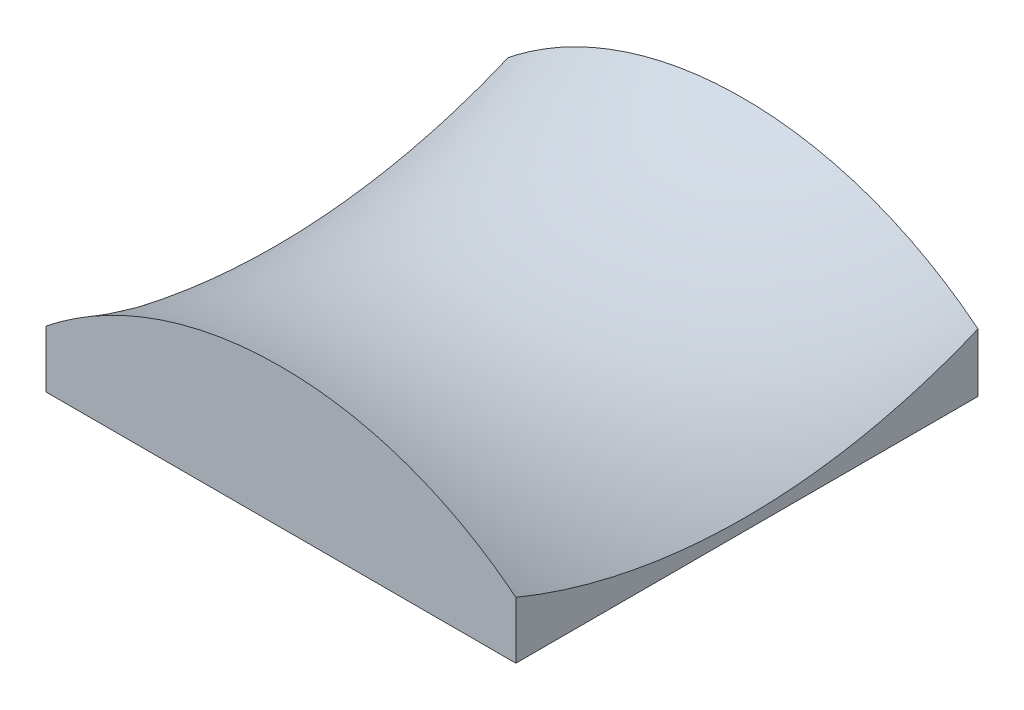
ISO-10303-21;
HEADER;
FILE_DESCRIPTION(('STEP AP214'),'2;1');
FILE_NAME('part.step','',(''),(''),'','','');
FILE_SCHEMA(('AUTOMOTIVE_DESIGN { 1 0 10303 214 1 1 1 1 }'));
ENDSEC;
DATA;
#1=APPLICATION_CONTEXT('core data for automotive mechanical design processes');
#2=APPLICATION_PROTOCOL_DEFINITION('international standard','automotive_design',2000,#1);
#3=PRODUCT_CONTEXT('',#1,'mechanical');
#4=PRODUCT('Part','Part','',(#3));
#5=PRODUCT_RELATED_PRODUCT_CATEGORY('part','',(#4));
#6=PRODUCT_DEFINITION_FORMATION('','',#4);
#7=PRODUCT_DEFINITION_CONTEXT('part definition',#1,'design');
#8=PRODUCT_DEFINITION('design','',#6,#7);
#9=PRODUCT_DEFINITION_SHAPE('','',#8);
#10=(LENGTH_UNIT() NAMED_UNIT(*) SI_UNIT(.MILLI.,.METRE.));
#11=(NAMED_UNIT(*) PLANE_ANGLE_UNIT() SI_UNIT($,.RADIAN.));
#12=(NAMED_UNIT(*) SI_UNIT($,.STERADIAN.) SOLID_ANGLE_UNIT());
#13=UNCERTAINTY_MEASURE_WITH_UNIT(LENGTH_MEASURE(1.E-05),#10,'distance_accuracy_value','');
#14=(GEOMETRIC_REPRESENTATION_CONTEXT(3) GLOBAL_UNCERTAINTY_ASSIGNED_CONTEXT((#13)) GLOBAL_UNIT_ASSIGNED_CONTEXT((#10,
#11,#12)) REPRESENTATION_CONTEXT('',''));
#15=CARTESIAN_POINT('',(0.,0.,0.));
#16=DIRECTION('',(0.,0.,1.));
#17=DIRECTION('',(1.,0.,0.));
#18=AXIS2_PLACEMENT_3D('',#15,#16,#17);
#19=CARTESIAN_POINT('',(-63.5,20.1195903798692,-62.9245870940822));
#20=DIRECTION('',(1.,0.,0.));
#21=DIRECTION('',(0.,0.,-1.));
#22=AXIS2_PLACEMENT_3D('',#19,#20,#21);
#23=PLANE('',#22);
#24=CARTESIAN_POINT('',(-63.5,-9.58852542034039,62.9245870940823));
#25=CARTESIAN_POINT('',(-63.5,-11.6771339613547,57.9611519657451));
#26=CARTESIAN_POINT('',(-63.5,-15.359738158942,47.8261554328779));
#27=CARTESIAN_POINT('',(-63.4999999999999,-19.3448665061603,32.1497916107984));
#28=CARTESIAN_POINT('',(-63.5000000000001,-21.751907816955,16.154924222973));
#29=CARTESIAN_POINT('',(-63.5,-22.2885254203404,5.38497668618995));
#30=CARTESIAN_POINT('',(-63.5,-22.2885254203403,-5.38497668619003));
#31=CARTESIAN_POINT('',(-63.5,-21.7519078169548,-16.1549242229729));
#32=CARTESIAN_POINT('',(-63.5,-19.3448665061598,-32.1497916107985));
#33=CARTESIAN_POINT('',(-63.5,-15.3597381589413,-47.8261554328778));
#34=CARTESIAN_POINT('',(-63.5,-11.6771339613538,-57.961151965745));
#35=CARTESIAN_POINT('',(-63.5,-9.58852542033947,-62.9245870940822));
#36=B_SPLINE_CURVE_WITH_KNOTS('',3,(#24,#25,#26,#27,#28,#29,#30,#31,#32,#33,#34,#35),
.UNSPECIFIED.,.F.,.F.,(4,1,1,1,2,1,1,1,4),(0.,0.125,0.25,0.375,0.5,0.625,0.75,0.875,1.),.UNSPECIFIED.);
#37=CARTESIAN_POINT('',(-63.5,-9.58852542033947,-62.9245870940822));
#38=VERTEX_POINT('',#37);
#39=CARTESIAN_POINT('',(-63.5,-9.97729039613173,61.9926057392416));
#40=VERTEX_POINT('',#39);
#41=EDGE_CURVE('E120',#38,#40,#36,.F.);
#42=ORIENTED_EDGE('',*,*,#41,.F.);
#43=DIRECTION('',(0.,-1.,0.));
#44=VECTOR('',#43,1.);
#45=CARTESIAN_POINT('',(-63.5,20.1195903798692,-62.9245870940822));
#46=LINE('',#45,#44);
#47=CARTESIAN_POINT('',(-63.5,-25.4,-62.9245870940822));
#48=VERTEX_POINT('',#47);
#49=EDGE_CURVE('E73',#38,#48,#46,.T.);
#50=ORIENTED_EDGE('',*,*,#49,.T.);
#51=DIRECTION('',(0.,0.,1.));
#52=VECTOR('',#51,1.);
#53=CARTESIAN_POINT('',(-63.5,-25.4,-62.9245870940822));
#54=LINE('',#53,#52);
#55=CARTESIAN_POINT('',(-63.5,-25.4,61.9926057392416));
#56=VERTEX_POINT('',#55);
#57=EDGE_CURVE('E118',#48,#56,#54,.T.);
#58=ORIENTED_EDGE('',*,*,#57,.T.);
#59=DIRECTION('',(0.,-1.,0.));
#60=VECTOR('',#59,1.);
#61=CARTESIAN_POINT('',(-63.5,20.1195903798692,61.9926057392416));
#62=LINE('',#61,#60);
#63=EDGE_CURVE('E108',#40,#56,#62,.T.);
#64=ORIENTED_EDGE('',*,*,#63,.F.);
#65=EDGE_LOOP('',(#42,#50,#58,#64));
#66=FACE_BOUND('',#65,.T.);
#67=ADVANCED_FACE('F66',(#66),#23,.F.);
#68=CARTESIAN_POINT('',(-63.5,20.1195903798692,61.9926057392416));
#69=DIRECTION('',(0.,0.,-1.));
#70=DIRECTION('',(-1.,0.,0.));
#71=AXIS2_PLACEMENT_3D('',#68,#69,#70);
#72=PLANE('',#71);
#73=CARTESIAN_POINT('',(-63.5,-9.97729039613173,61.9926057392416));
#74=CARTESIAN_POINT('',(-62.3858267250707,-9.08519551380279,61.9926057392416));
#75=CARTESIAN_POINT('',(-61.2530087164492,-8.21636995396604,61.9926057392416));
#76=CARTESIAN_POINT('',(-58.9519717874313,-6.52693070912617,61.9926057392416));
#77=CARTESIAN_POINT('',(-57.7837527594994,-5.70631717059594,61.9926057392416));
#78=CARTESIAN_POINT('',(-55.4138226699182,-4.11498972369493,61.9926057392416));
#79=CARTESIAN_POINT('',(-54.2121119908295,-3.34427524568298,61.9926057392416));
#80=CARTESIAN_POINT('',(-51.7772442025432,-1.85425068168243,61.9926057392416));
#81=CARTESIAN_POINT('',(-50.5440873223408,-1.1349402215083,61.9926057392416));
#82=CARTESIAN_POINT('',(-48.0493413743138,0.250411461218553,61.9926057392416));
#83=CARTESIAN_POINT('',(-46.7877729567808,0.91648986840684,61.9926057392416));
#84=CARTESIAN_POINT('',(-44.2376242476867,2.19468531568515,61.9926057392416));
#85=CARTESIAN_POINT('',(-42.9490445118388,2.80680346457212,61.9926057392416));
#86=CARTESIAN_POINT('',(-40.34715683212,3.97598156227411,61.9926057392416));
#87=CARTESIAN_POINT('',(-39.0338492372394,4.53304228743555,61.9926057392416));
#88=CARTESIAN_POINT('',(-36.3848984626601,5.59112476005631,61.9926057392416));
#89=CARTESIAN_POINT('',(-35.049255465449,6.09214696511203,61.9926057392416));
#90=CARTESIAN_POINT('',(-31.9085068927262,7.19516796209275,61.9926057392416));
#91=CARTESIAN_POINT('',(-30.0955719509714,7.77501630113208,61.9926057392416));
#92=CARTESIAN_POINT('',(-26.4399671038488,8.83179619002194,61.9926057392416));
#93=CARTESIAN_POINT('',(-24.5972964835928,9.30872526157242,61.9926057392416));
#94=CARTESIAN_POINT('',(-20.8880597046299,10.1583526425888,61.9926057392416));
#95=CARTESIAN_POINT('',(-19.0214934441596,10.5310505080148,61.9926057392416));
#96=CARTESIAN_POINT('',(-15.2708906801847,11.1711239899075,61.9926057392416));
#97=CARTESIAN_POINT('',(-13.3868587925481,11.4385266651528,61.9926057392416));
#98=CARTESIAN_POINT('',(-9.60679700298625,11.8674516630818,61.9926057392416));
#99=CARTESIAN_POINT('',(-7.71076719657034,12.0289748275515,61.9926057392416));
#100=CARTESIAN_POINT('',(-3.91264992682951,12.2457324586483,61.9926057392416));
#101=CARTESIAN_POINT('',(-2.01056248339513,12.3009672739187,61.9926057392415));
#102=CARTESIAN_POINT('',(1.79744519296852,12.3050143596191,61.9926057392415));
#103=CARTESIAN_POINT('',(3.7033656504428,12.2536184003666,61.9926057392416));
#104=CARTESIAN_POINT('',(7.50934530576351,12.0441122955624,61.9926057392416));
#105=CARTESIAN_POINT('',(9.40940446682123,11.8860014815734,61.9926057392416));
#106=CARTESIAN_POINT('',(13.1976825058477,11.4634673017587,61.9926057392416));
#107=CARTESIAN_POINT('',(15.0859012833029,11.1990430346709,61.9926057392416));
#108=CARTESIAN_POINT('',(18.8450260470154,10.5644830477057,61.9926057392416));
#109=CARTESIAN_POINT('',(20.7159271978978,10.1943186710272,61.9926057392416));
#110=CARTESIAN_POINT('',(24.4339172992252,9.34931169464277,61.9926057392416));
#111=CARTESIAN_POINT('',(26.2810063602229,8.87446958111026,61.9926057392416));
#112=CARTESIAN_POINT('',(29.9454981167175,7.82141423965829,61.9926057392416));
#113=CARTESIAN_POINT('',(31.7629014879997,7.24320336848518,61.9926057392416));
#114=CARTESIAN_POINT('',(34.9146821602635,6.14153419648396,61.9926057392416));
#115=CARTESIAN_POINT('',(36.2568386419594,5.64018901610861,61.9926057392416));
#116=CARTESIAN_POINT('',(38.9186974001437,4.58094255509184,61.9926057392416));
#117=CARTESIAN_POINT('',(40.2383994501779,4.02304070446741,61.9926057392416));
#118=CARTESIAN_POINT('',(42.8529235567109,2.85167138948634,61.9926057392416));
#119=CARTESIAN_POINT('',(44.1477452296799,2.23820306940696,61.9926057392416));
#120=CARTESIAN_POINT('',(46.7101928539036,0.956809680182645,61.9926057392416));
#121=CARTESIAN_POINT('',(47.9778182241252,0.288883449036795,61.9926057392416));
#122=CARTESIAN_POINT('',(50.484492066055,-1.10066381601003,61.9926057392416));
#123=CARTESIAN_POINT('',(51.7235191027851,-1.82232351498231,61.9926057392416));
#124=CARTESIAN_POINT('',(54.1698784493954,-3.31751673450718,61.9926057392416));
#125=CARTESIAN_POINT('',(55.3772105393621,-4.09105061485365,61.9926057392416));
#126=CARTESIAN_POINT('',(57.7581061950025,-5.68846846724618,61.9926057392416));
#127=CARTESIAN_POINT('',(58.9316693931009,-6.51235298705571,61.9926057392416));
#128=CARTESIAN_POINT('',(61.2430912110149,-8.20876397215274,61.9926057392416));
#129=CARTESIAN_POINT('',(62.3809499724628,-9.08129024445012,61.9926057392416));
#130=CARTESIAN_POINT('',(63.5,-9.97729039613173,61.9926057392416));
#131=B_SPLINE_CURVE_WITH_KNOTS('',3,(#73,#74,#75,#76,#77,#78,#79,#80,#81,#82,#83,#84,#85,#86,
#87,#88,#89,#90,#91,#92,#93,#94,#95,#96,#97,#98,#99,#100,#101,#102,#103,#104,#105,#106,#107,
#108,#109,#110,#111,#112,#113,#114,#115,#116,#117,#118,#119,#120,#121,#122,#123,#124,#125,#126,
#127,#128,#129,#130),.UNSPECIFIED.,.F.,.F.,(4,2,2,2,2,2,2,2,2,2,2,2,2,2,2,2,2,2,2,2,2,2,2,2,2,2,
2,2,4),(0.,4.28163684503326,8.56328669743046,12.8448876624495,17.1264574572132,21.4050097827165,
25.6834741703135,29.9618782200977,34.2402473309638,39.9473097594336,45.6545095988628,
51.3617337514093,57.0674903017127,62.7732014883368,68.478893959259,74.1957390524429,
79.9126199549624,85.6295493228135,91.3480295174167,97.0664831532298,102.784806428316,
107.081799176775,111.378835235005,115.675937478776,119.973131436388,124.273447984337,
128.573794361916,132.874187531199,137.174563639536),.UNSPECIFIED.);
#132=CARTESIAN_POINT('',(63.5,-9.97729039613173,61.9926057392416));
#133=VERTEX_POINT('',#132);
#134=EDGE_CURVE('E114',#40,#133,#131,.T.);
#135=ORIENTED_EDGE('',*,*,#134,.F.);
#136=ORIENTED_EDGE('',*,*,#63,.T.);
#137=DIRECTION('',(1.,0.,0.));
#138=VECTOR('',#137,1.);
#139=CARTESIAN_POINT('',(-63.5,-25.4,61.9926057392416));
#140=LINE('',#139,#138);
#141=CARTESIAN_POINT('',(63.5,-25.4,61.9926057392416));
#142=VERTEX_POINT('',#141);
#143=EDGE_CURVE('E128',#56,#142,#140,.T.);
#144=ORIENTED_EDGE('',*,*,#143,.T.);
#145=DIRECTION('',(0.,-1.,0.));
#146=VECTOR('',#145,1.);
#147=CARTESIAN_POINT('',(63.5,20.1195903798692,61.9926057392416));
#148=LINE('',#147,#146);
#149=EDGE_CURVE('E207',#133,#142,#148,.T.);
#150=ORIENTED_EDGE('',*,*,#149,.F.);
#151=EDGE_LOOP('',(#135,#136,#144,#150));
#152=FACE_BOUND('',#151,.T.);
#153=ADVANCED_FACE('F157',(#152),#72,.F.);
#154=CARTESIAN_POINT('',(63.5,20.1195903798692,-62.9245870940822));
#155=DIRECTION('',(-1.,0.,0.));
#156=DIRECTION('',(0.,0.,1.));
#157=AXIS2_PLACEMENT_3D('',#154,#155,#156);
#158=PLANE('',#157);
#159=CARTESIAN_POINT('',(63.5,-9.58852542034039,62.9245870940823));
#160=CARTESIAN_POINT('',(63.5,-11.6771339613547,57.9611519657451));
#161=CARTESIAN_POINT('',(63.4999999999999,-15.359738158942,47.8261554328779));
#162=CARTESIAN_POINT('',(63.5,-19.3448665061603,32.1497916107984));
#163=CARTESIAN_POINT('',(63.5,-21.751907816955,16.154924222973));
#164=CARTESIAN_POINT('',(63.5,-22.2885254203404,5.38497668618995));
#165=CARTESIAN_POINT('',(63.5,-22.2885254203403,-5.38497668619003));
#166=CARTESIAN_POINT('',(63.4999999999999,-21.7519078169548,-16.1549242229729));
#167=CARTESIAN_POINT('',(63.5,-19.3448665061598,-32.1497916107985));
#168=CARTESIAN_POINT('',(63.5,-15.3597381589413,-47.8261554328778));
#169=CARTESIAN_POINT('',(63.5,-11.6771339613538,-57.961151965745));
#170=CARTESIAN_POINT('',(63.5,-9.58852542033947,-62.9245870940822));
#171=B_SPLINE_CURVE_WITH_KNOTS('',3,(#159,#160,#161,#162,#163,#164,#165,#166,#167,#168,#169,
#170),.UNSPECIFIED.,.F.,.F.,(4,1,1,1,2,1,1,1,4),(0.,0.125,0.25,0.375,0.5,0.625,0.75,0.875,1.),.UNSPECIFIED.);
#172=CARTESIAN_POINT('',(63.5,-9.58852542033947,-62.9245870940822));
#173=VERTEX_POINT('',#172);
#174=EDGE_CURVE('E78',#133,#173,#171,.T.);
#175=ORIENTED_EDGE('',*,*,#174,.F.);
#176=ORIENTED_EDGE('',*,*,#149,.T.);
#177=DIRECTION('',(0.,0.,-1.));
#178=VECTOR('',#177,1.);
#179=CARTESIAN_POINT('',(63.5,-25.4,-62.9245870940822));
#180=LINE('',#179,#178);
#181=CARTESIAN_POINT('',(63.5,-25.4,-62.9245870940822));
#182=VERTEX_POINT('',#181);
#183=EDGE_CURVE('E208',#142,#182,#180,.T.);
#184=ORIENTED_EDGE('',*,*,#183,.T.);
#185=DIRECTION('',(0.,-1.,0.));
#186=VECTOR('',#185,1.);
#187=CARTESIAN_POINT('',(63.5,20.1195903798692,-62.9245870940822));
#188=LINE('',#187,#186);
#189=EDGE_CURVE('E91',#173,#182,#188,.T.);
#190=ORIENTED_EDGE('',*,*,#189,.F.);
#191=EDGE_LOOP('',(#175,#176,#184,#190));
#192=FACE_BOUND('',#191,.T.);
#193=ADVANCED_FACE('F161',(#192),#158,.F.);
#194=CARTESIAN_POINT('',(-63.5,20.1195903798692,-62.9245870940822));
#195=DIRECTION('',(0.,0.,1.));
#196=DIRECTION('',(1.,0.,0.));
#197=AXIS2_PLACEMENT_3D('',#194,#195,#196);
#198=PLANE('',#197);
#199=CARTESIAN_POINT('',(63.5,-9.58852542033947,-62.9245870940822));
#200=CARTESIAN_POINT('',(26.3958242579015,20.1185903798692,-62.9245870940821));
#201=CARTESIAN_POINT('',(-26.3958242579015,20.1185903798692,-62.9245870940821));
#202=CARTESIAN_POINT('',(-63.5,-9.58852542033947,-62.9245870940822));
#203=B_SPLINE_CURVE_WITH_KNOTS('',3,(#199,#200,#201,#202),.UNSPECIFIED.,.F.,.F.,(4,4),(0.,1.),.UNSPECIFIED.);
#204=EDGE_CURVE('E14',#173,#38,#203,.T.);
#205=ORIENTED_EDGE('',*,*,#204,.F.);
#206=ORIENTED_EDGE('',*,*,#189,.T.);
#207=DIRECTION('',(-1.,0.,0.));
#208=VECTOR('',#207,1.);
#209=CARTESIAN_POINT('',(-63.5,-25.4,-62.9245870940822));
#210=LINE('',#209,#208);
#211=EDGE_CURVE('E122',#182,#48,#210,.T.);
#212=ORIENTED_EDGE('',*,*,#211,.T.);
#213=ORIENTED_EDGE('',*,*,#49,.F.);
#214=EDGE_LOOP('',(#205,#206,#212,#213));
#215=FACE_BOUND('',#214,.T.);
#216=ADVANCED_FACE('F123',(#215),#198,.F.);
#217=CARTESIAN_POINT('',(0.,-25.4,0.));
#218=DIRECTION('',(0.,1.,0.));
#219=DIRECTION('',(0.,0.,1.));
#220=AXIS2_PLACEMENT_3D('',#217,#218,#219);
#221=PLANE('',#220);
#222=ORIENTED_EDGE('',*,*,#57,.F.);
#223=ORIENTED_EDGE('',*,*,#211,.F.);
#224=ORIENTED_EDGE('',*,*,#183,.F.);
#225=ORIENTED_EDGE('',*,*,#143,.F.);
#226=EDGE_LOOP('',(#222,#223,#224,#225));
#227=FACE_BOUND('',#226,.T.);
#228=ADVANCED_FACE('F127',(#227),#221,.F.);
#229=CARTESIAN_POINT('',(63.5,-9.58852542034039,62.9245870940823));
#230=CARTESIAN_POINT('',(26.3958242579015,20.1185903798683,62.9245870940823));
#231=CARTESIAN_POINT('',(-26.3958242579015,20.1185903798683,62.9245870940823));
#232=CARTESIAN_POINT('',(-63.5,-9.58852542034039,62.9245870940823));
#233=CARTESIAN_POINT('',(63.5,-11.6771339613547,57.9611519657451));
#234=CARTESIAN_POINT('',(26.3958242579014,18.029981838854,57.9611519657451));
#235=CARTESIAN_POINT('',(-26.3958242579015,18.029981838854,57.9611519657451));
#236=CARTESIAN_POINT('',(-63.5,-11.6771339613547,57.9611519657451));
#237=CARTESIAN_POINT('',(63.4999999999999,-15.359738158942,47.8261554328779));
#238=CARTESIAN_POINT('',(26.3958242579014,14.3473776412667,47.826155432878));
#239=CARTESIAN_POINT('',(-26.3958242579015,14.3473776412667,47.826155432878));
#240=CARTESIAN_POINT('',(-63.5,-15.359738158942,47.8261554328779));
#241=CARTESIAN_POINT('',(63.5,-19.3448665061603,32.1497916107984));
#242=CARTESIAN_POINT('',(26.3958242579015,10.3622492940483,32.1497916107984));
#243=CARTESIAN_POINT('',(-26.3958242579014,10.3622492940483,32.1497916107984));
#244=CARTESIAN_POINT('',(-63.4999999999999,-19.3448665061603,32.1497916107984));
#245=CARTESIAN_POINT('',(63.5,-21.751907816955,16.154924222973));
#246=CARTESIAN_POINT('',(26.3958242579015,7.95520798325363,16.154924222973));
#247=CARTESIAN_POINT('',(-26.3958242579015,7.95520798325363,16.154924222973));
#248=CARTESIAN_POINT('',(-63.5000000000001,-21.751907816955,16.154924222973));
#249=CARTESIAN_POINT('',(63.5,-22.2885254203404,5.38497668618995));
#250=CARTESIAN_POINT('',(26.3958242579014,7.41859037986825,5.38497668618999));
#251=CARTESIAN_POINT('',(-26.3958242579015,7.41859037986825,5.38497668618999));
#252=CARTESIAN_POINT('',(-63.5,-22.2885254203404,5.38497668618995));
#253=CARTESIAN_POINT('',(63.5,-22.2885254203403,-5.38497668619003));
#254=CARTESIAN_POINT('',(26.3958242579014,7.41859037986833,-5.38497668618999));
#255=CARTESIAN_POINT('',(-26.3958242579015,7.41859037986833,-5.38497668618999));
#256=CARTESIAN_POINT('',(-63.5,-22.2885254203403,-5.38497668619003));
#257=CARTESIAN_POINT('',(63.4999999999999,-21.7519078169548,-16.1549242229729));
#258=CARTESIAN_POINT('',(26.3958242579014,7.95520798325385,-16.1549242229729));
#259=CARTESIAN_POINT('',(-26.3958242579015,7.95520798325385,-16.1549242229729));
#260=CARTESIAN_POINT('',(-63.5,-21.7519078169548,-16.1549242229729));
#261=CARTESIAN_POINT('',(63.5,-19.3448665061598,-32.1497916107985));
#262=CARTESIAN_POINT('',(26.3958242579015,10.3622492940488,-32.1497916107985));
#263=CARTESIAN_POINT('',(-26.3958242579015,10.3622492940488,-32.1497916107985));
#264=CARTESIAN_POINT('',(-63.5,-19.3448665061598,-32.1497916107985));
#265=CARTESIAN_POINT('',(63.5,-15.3597381589413,-47.8261554328778));
#266=CARTESIAN_POINT('',(26.3958242579015,14.3473776412673,-47.8261554328777));
#267=CARTESIAN_POINT('',(-26.3958242579015,14.3473776412673,-47.8261554328777));
#268=CARTESIAN_POINT('',(-63.5,-15.3597381589413,-47.8261554328778));
#269=CARTESIAN_POINT('',(63.5,-11.6771339613538,-57.961151965745));
#270=CARTESIAN_POINT('',(26.3958242579014,18.0299818388548,-57.9611519657449));
#271=CARTESIAN_POINT('',(-26.3958242579015,18.0299818388548,-57.9611519657449));
#272=CARTESIAN_POINT('',(-63.5,-11.6771339613538,-57.961151965745));
#273=CARTESIAN_POINT('',(63.5,-9.58852542033947,-62.9245870940822));
#274=CARTESIAN_POINT('',(26.3958242579015,20.1185903798692,-62.9245870940821));
#275=CARTESIAN_POINT('',(-26.3958242579015,20.1185903798692,-62.9245870940821));
#276=CARTESIAN_POINT('',(-63.5,-9.58852542033947,-62.9245870940822));
#277=B_SPLINE_SURFACE_WITH_KNOTS('',3,3,((#229,#230,#231,#232),(#233,#234,#235,#236),(#237,#238,
#239,#240),(#241,#242,#243,#244),(#245,#246,#247,#248),(#249,#250,#251,#252),(#253,#254,#255,
#256),(#257,#258,#259,#260),(#261,#262,#263,#264),(#265,#266,#267,#268),(#269,#270,#271,#272),
(#273,#274,#275,#276)),.UNSPECIFIED.,.F.,.F.,.F.,(4,1,1,1,2,1,1,1,4),(4,4),(0.,0.125,0.25,0.375,
0.5,0.625,0.75,0.875,1.),(0.,1.),.UNSPECIFIED.);
#278=ORIENTED_EDGE('',*,*,#41,.T.);
#279=ORIENTED_EDGE('',*,*,#134,.T.);
#280=ORIENTED_EDGE('',*,*,#174,.T.);
#281=ORIENTED_EDGE('',*,*,#204,.T.);
#282=EDGE_LOOP('',(#278,#279,#280,#281));
#283=FACE_BOUND('',#282,.T.);
#284=ADVANCED_FACE('F68',(#283),#277,.T.);
#285=CLOSED_SHELL('',(#67,#153,#193,#216,#228,#284));
#286=MANIFOLD_SOLID_BREP('B2',#285);
#287=ADVANCED_BREP_SHAPE_REPRESENTATION('',(#18,#286),#14);
#288=SHAPE_DEFINITION_REPRESENTATION(#9,#287);
ENDSEC;
END-ISO-10303-21;
